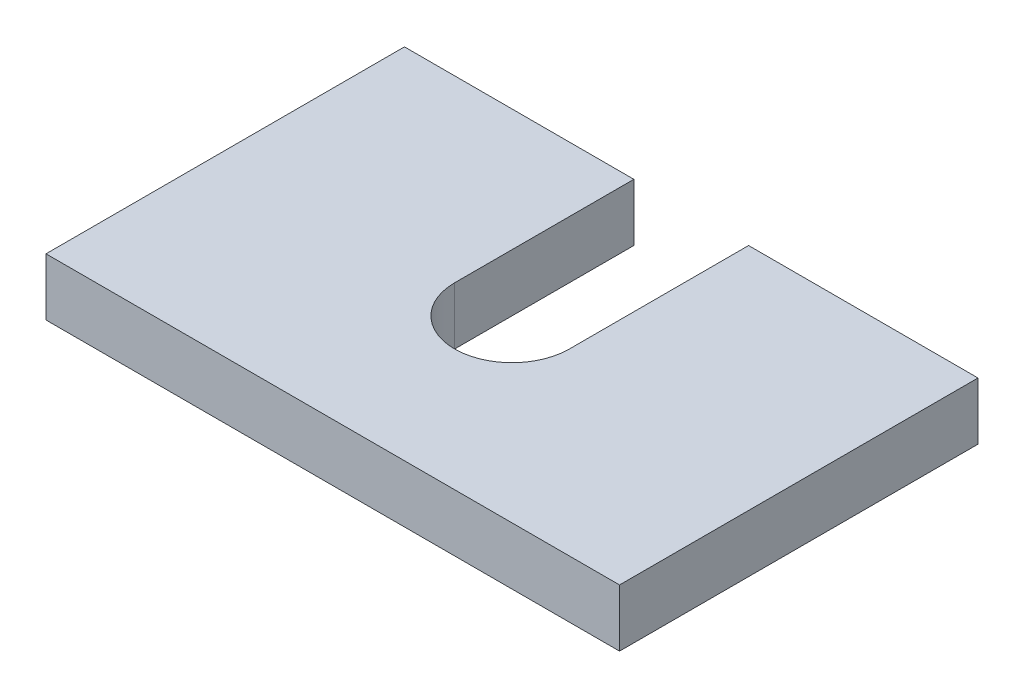
ISO-10303-21;
HEADER;
FILE_DESCRIPTION(('STEP AP214'),'2;1');
FILE_NAME('part.step','',(''),(''),'','','');
FILE_SCHEMA(('AUTOMOTIVE_DESIGN { 1 0 10303 214 1 1 1 1 }'));
ENDSEC;
DATA;
#1=APPLICATION_CONTEXT('core data for automotive mechanical design processes');
#2=APPLICATION_PROTOCOL_DEFINITION('international standard','automotive_design',2000,#1);
#3=PRODUCT_CONTEXT('',#1,'mechanical');
#4=PRODUCT('Part','Part','',(#3));
#5=PRODUCT_RELATED_PRODUCT_CATEGORY('part','',(#4));
#6=PRODUCT_DEFINITION_FORMATION('','',#4);
#7=PRODUCT_DEFINITION_CONTEXT('part definition',#1,'design');
#8=PRODUCT_DEFINITION('design','',#6,#7);
#9=PRODUCT_DEFINITION_SHAPE('','',#8);
#10=(LENGTH_UNIT() NAMED_UNIT(*) SI_UNIT(.MILLI.,.METRE.));
#11=(NAMED_UNIT(*) PLANE_ANGLE_UNIT() SI_UNIT($,.RADIAN.));
#12=(NAMED_UNIT(*) SI_UNIT($,.STERADIAN.) SOLID_ANGLE_UNIT());
#13=UNCERTAINTY_MEASURE_WITH_UNIT(LENGTH_MEASURE(1.E-05),#10,'distance_accuracy_value','');
#14=(GEOMETRIC_REPRESENTATION_CONTEXT(3) GLOBAL_UNCERTAINTY_ASSIGNED_CONTEXT((#13)) GLOBAL_UNIT_ASSIGNED_CONTEXT((#10,
#11,#12)) REPRESENTATION_CONTEXT('',''));
#15=CARTESIAN_POINT('',(0.,0.,0.));
#16=DIRECTION('',(0.,0.,1.));
#17=DIRECTION('',(1.,0.,0.));
#18=AXIS2_PLACEMENT_3D('',#15,#16,#17);
#19=CARTESIAN_POINT('',(4.,4.,-12.5));
#20=DIRECTION('',(0.,0.,1.));
#21=DIRECTION('',(1.,0.,0.));
#22=AXIS2_PLACEMENT_3D('',#19,#20,#21);
#23=PLANE('',#22);
#24=DIRECTION('',(-1.,0.,0.));
#25=VECTOR('',#24,1.);
#26=CARTESIAN_POINT('',(4.,0.,-12.5));
#27=LINE('',#26,#25);
#28=CARTESIAN_POINT('',(20.,0.,-12.5));
#29=VERTEX_POINT('',#28);
#30=CARTESIAN_POINT('',(4.,0.,-12.5));
#31=VERTEX_POINT('',#30);
#32=EDGE_CURVE('E128',#29,#31,#27,.T.);
#33=ORIENTED_EDGE('',*,*,#32,.T.);
#34=DIRECTION('',(0.,-1.,0.));
#35=VECTOR('',#34,1.);
#36=CARTESIAN_POINT('',(4.,4.,-12.5));
#37=LINE('',#36,#35);
#38=CARTESIAN_POINT('',(4.,4.,-12.5));
#39=VERTEX_POINT('',#38);
#40=EDGE_CURVE('E11',#39,#31,#37,.T.);
#41=ORIENTED_EDGE('',*,*,#40,.F.);
#42=DIRECTION('',(-1.,0.,0.));
#43=VECTOR('',#42,1.);
#44=CARTESIAN_POINT('',(4.,4.,-12.5));
#45=LINE('',#44,#43);
#46=CARTESIAN_POINT('',(20.,4.,-12.5));
#47=VERTEX_POINT('',#46);
#48=EDGE_CURVE('E142',#47,#39,#45,.T.);
#49=ORIENTED_EDGE('',*,*,#48,.F.);
#50=DIRECTION('',(0.,-1.,0.));
#51=VECTOR('',#50,1.);
#52=CARTESIAN_POINT('',(20.,4.,-12.5));
#53=LINE('',#52,#51);
#54=EDGE_CURVE('E124',#47,#29,#53,.T.);
#55=ORIENTED_EDGE('',*,*,#54,.T.);
#56=EDGE_LOOP('',(#33,#41,#49,#55));
#57=FACE_BOUND('',#56,.T.);
#58=ADVANCED_FACE('F32',(#57),#23,.F.);
#59=CARTESIAN_POINT('',(4.,4.,0.));
#60=DIRECTION('',(1.,0.,0.));
#61=DIRECTION('',(0.,0.,-1.));
#62=AXIS2_PLACEMENT_3D('',#59,#60,#61);
#63=PLANE('',#62);
#64=DIRECTION('',(0.,0.,1.));
#65=VECTOR('',#64,1.);
#66=CARTESIAN_POINT('',(4.,0.,0.));
#67=LINE('',#66,#65);
#68=CARTESIAN_POINT('',(4.,0.,0.));
#69=VERTEX_POINT('',#68);
#70=EDGE_CURVE('E131',#31,#69,#67,.T.);
#71=ORIENTED_EDGE('',*,*,#70,.T.);
#72=DIRECTION('',(0.,-1.,0.));
#73=VECTOR('',#72,1.);
#74=CARTESIAN_POINT('',(4.,4.,0.));
#75=LINE('',#74,#73);
#76=CARTESIAN_POINT('',(4.,4.,0.));
#77=VERTEX_POINT('',#76);
#78=EDGE_CURVE('E40',#77,#69,#75,.T.);
#79=ORIENTED_EDGE('',*,*,#78,.F.);
#80=DIRECTION('',(0.,0.,1.));
#81=VECTOR('',#80,1.);
#82=CARTESIAN_POINT('',(4.,4.,0.));
#83=LINE('',#82,#81);
#84=EDGE_CURVE('E91',#39,#77,#83,.T.);
#85=ORIENTED_EDGE('',*,*,#84,.F.);
#86=ORIENTED_EDGE('',*,*,#40,.T.);
#87=EDGE_LOOP('',(#71,#79,#85,#86));
#88=FACE_BOUND('',#87,.T.);
#89=ADVANCED_FACE('F177',(#88),#63,.F.);
#90=CARTESIAN_POINT('',(0.,4.,0.));
#91=DIRECTION('',(0.,-1.,0.));
#92=DIRECTION('',(0.,0.,-1.));
#93=AXIS2_PLACEMENT_3D('',#90,#91,#92);
#94=CYLINDRICAL_SURFACE('',#93,4.);
#95=CARTESIAN_POINT('',(0.,0.,0.));
#96=DIRECTION('',(0.,-1.,0.));
#97=DIRECTION('',(0.,0.,1.));
#98=AXIS2_PLACEMENT_3D('',#95,#96,#97);
#99=CIRCLE('',#98,4.);
#100=CARTESIAN_POINT('',(-4.,0.,0.));
#101=VERTEX_POINT('',#100);
#102=EDGE_CURVE('E133',#69,#101,#99,.T.);
#103=ORIENTED_EDGE('',*,*,#102,.T.);
#104=DIRECTION('',(0.,-1.,0.));
#105=VECTOR('',#104,1.);
#106=CARTESIAN_POINT('',(-4.,4.,0.));
#107=LINE('',#106,#105);
#108=CARTESIAN_POINT('',(-4.,4.,0.));
#109=VERTEX_POINT('',#108);
#110=EDGE_CURVE('E149',#109,#101,#107,.T.);
#111=ORIENTED_EDGE('',*,*,#110,.F.);
#112=CARTESIAN_POINT('',(0.,4.,0.));
#113=DIRECTION('',(0.,-1.,0.));
#114=DIRECTION('',(0.,0.,1.));
#115=AXIS2_PLACEMENT_3D('',#112,#113,#114);
#116=CIRCLE('',#115,4.);
#117=EDGE_CURVE('E157',#77,#109,#116,.T.);
#118=ORIENTED_EDGE('',*,*,#117,.F.);
#119=ORIENTED_EDGE('',*,*,#78,.T.);
#120=EDGE_LOOP('',(#103,#111,#118,#119));
#121=FACE_BOUND('',#120,.T.);
#122=ADVANCED_FACE('F155',(#121),#94,.F.);
#123=CARTESIAN_POINT('',(-4.,4.,0.));
#124=DIRECTION('',(-1.,0.,0.));
#125=DIRECTION('',(0.,0.,1.));
#126=AXIS2_PLACEMENT_3D('',#123,#124,#125);
#127=PLANE('',#126);
#128=DIRECTION('',(0.,0.,-1.));
#129=VECTOR('',#128,1.);
#130=CARTESIAN_POINT('',(-4.,0.,0.));
#131=LINE('',#130,#129);
#132=CARTESIAN_POINT('',(-4.,0.,-12.5));
#133=VERTEX_POINT('',#132);
#134=EDGE_CURVE('E135',#101,#133,#131,.T.);
#135=ORIENTED_EDGE('',*,*,#134,.T.);
#136=DIRECTION('',(0.,-1.,0.));
#137=VECTOR('',#136,1.);
#138=CARTESIAN_POINT('',(-4.,4.,-12.5));
#139=LINE('',#138,#137);
#140=CARTESIAN_POINT('',(-4.,4.,-12.5));
#141=VERTEX_POINT('',#140);
#142=EDGE_CURVE('E146',#141,#133,#139,.T.);
#143=ORIENTED_EDGE('',*,*,#142,.F.);
#144=DIRECTION('',(0.,0.,-1.));
#145=VECTOR('',#144,1.);
#146=CARTESIAN_POINT('',(-4.,4.,0.));
#147=LINE('',#146,#145);
#148=EDGE_CURVE('E169',#109,#141,#147,.T.);
#149=ORIENTED_EDGE('',*,*,#148,.F.);
#150=ORIENTED_EDGE('',*,*,#110,.T.);
#151=EDGE_LOOP('',(#135,#143,#149,#150));
#152=FACE_BOUND('',#151,.T.);
#153=ADVANCED_FACE('F165',(#152),#127,.F.);
#154=CARTESIAN_POINT('',(-20.,4.,-12.5));
#155=DIRECTION('',(0.,0.,1.));
#156=DIRECTION('',(1.,0.,0.));
#157=AXIS2_PLACEMENT_3D('',#154,#155,#156);
#158=PLANE('',#157);
#159=DIRECTION('',(-1.,0.,0.));
#160=VECTOR('',#159,1.);
#161=CARTESIAN_POINT('',(-20.,0.,-12.5));
#162=LINE('',#161,#160);
#163=CARTESIAN_POINT('',(-20.,0.,-12.5));
#164=VERTEX_POINT('',#163);
#165=EDGE_CURVE('E137',#133,#164,#162,.T.);
#166=ORIENTED_EDGE('',*,*,#165,.T.);
#167=DIRECTION('',(0.,-1.,0.));
#168=VECTOR('',#167,1.);
#169=CARTESIAN_POINT('',(-20.,4.,-12.5));
#170=LINE('',#169,#168);
#171=CARTESIAN_POINT('',(-20.,4.,-12.5));
#172=VERTEX_POINT('',#171);
#173=EDGE_CURVE('E119',#172,#164,#170,.T.);
#174=ORIENTED_EDGE('',*,*,#173,.F.);
#175=DIRECTION('',(-1.,0.,0.));
#176=VECTOR('',#175,1.);
#177=CARTESIAN_POINT('',(-20.,4.,-12.5));
#178=LINE('',#177,#176);
#179=EDGE_CURVE('E110',#141,#172,#178,.T.);
#180=ORIENTED_EDGE('',*,*,#179,.F.);
#181=ORIENTED_EDGE('',*,*,#142,.T.);
#182=EDGE_LOOP('',(#166,#174,#180,#181));
#183=FACE_BOUND('',#182,.T.);
#184=ADVANCED_FACE('F168',(#183),#158,.F.);
#185=CARTESIAN_POINT('',(-20.,4.,12.5));
#186=DIRECTION('',(1.,0.,0.));
#187=DIRECTION('',(0.,0.,-1.));
#188=AXIS2_PLACEMENT_3D('',#185,#186,#187);
#189=PLANE('',#188);
#190=DIRECTION('',(0.,0.,1.));
#191=VECTOR('',#190,1.);
#192=CARTESIAN_POINT('',(-20.,0.,12.5));
#193=LINE('',#192,#191);
#194=CARTESIAN_POINT('',(-20.,0.,12.5));
#195=VERTEX_POINT('',#194);
#196=EDGE_CURVE('E118',#164,#195,#193,.T.);
#197=ORIENTED_EDGE('',*,*,#196,.T.);
#198=DIRECTION('',(0.,-1.,0.));
#199=VECTOR('',#198,1.);
#200=CARTESIAN_POINT('',(-20.,4.,12.5));
#201=LINE('',#200,#199);
#202=CARTESIAN_POINT('',(-20.,4.,12.5));
#203=VERTEX_POINT('',#202);
#204=EDGE_CURVE('E115',#203,#195,#201,.T.);
#205=ORIENTED_EDGE('',*,*,#204,.F.);
#206=DIRECTION('',(0.,0.,1.));
#207=VECTOR('',#206,1.);
#208=CARTESIAN_POINT('',(-20.,4.,12.5));
#209=LINE('',#208,#207);
#210=EDGE_CURVE('E104',#172,#203,#209,.T.);
#211=ORIENTED_EDGE('',*,*,#210,.F.);
#212=ORIENTED_EDGE('',*,*,#173,.T.);
#213=EDGE_LOOP('',(#197,#205,#211,#212));
#214=FACE_BOUND('',#213,.T.);
#215=ADVANCED_FACE('F116',(#214),#189,.F.);
#216=CARTESIAN_POINT('',(-20.,4.,12.5));
#217=DIRECTION('',(0.,0.,-1.));
#218=DIRECTION('',(-1.,0.,0.));
#219=AXIS2_PLACEMENT_3D('',#216,#217,#218);
#220=PLANE('',#219);
#221=DIRECTION('',(1.,0.,0.));
#222=VECTOR('',#221,1.);
#223=CARTESIAN_POINT('',(-20.,0.,12.5));
#224=LINE('',#223,#222);
#225=CARTESIAN_POINT('',(20.,0.,12.5));
#226=VERTEX_POINT('',#225);
#227=EDGE_CURVE('E77',#195,#226,#224,.T.);
#228=ORIENTED_EDGE('',*,*,#227,.T.);
#229=DIRECTION('',(0.,-1.,0.));
#230=VECTOR('',#229,1.);
#231=CARTESIAN_POINT('',(20.,4.,12.5));
#232=LINE('',#231,#230);
#233=CARTESIAN_POINT('',(20.,4.,12.5));
#234=VERTEX_POINT('',#233);
#235=EDGE_CURVE('E120',#234,#226,#232,.T.);
#236=ORIENTED_EDGE('',*,*,#235,.F.);
#237=DIRECTION('',(1.,0.,0.));
#238=VECTOR('',#237,1.);
#239=CARTESIAN_POINT('',(-20.,4.,12.5));
#240=LINE('',#239,#238);
#241=EDGE_CURVE('E108',#203,#234,#240,.T.);
#242=ORIENTED_EDGE('',*,*,#241,.F.);
#243=ORIENTED_EDGE('',*,*,#204,.T.);
#244=EDGE_LOOP('',(#228,#236,#242,#243));
#245=FACE_BOUND('',#244,.T.);
#246=ADVANCED_FACE('F122',(#245),#220,.F.);
#247=CARTESIAN_POINT('',(20.,4.,12.5));
#248=DIRECTION('',(-1.,0.,0.));
#249=DIRECTION('',(0.,0.,1.));
#250=AXIS2_PLACEMENT_3D('',#247,#248,#249);
#251=PLANE('',#250);
#252=DIRECTION('',(0.,0.,-1.));
#253=VECTOR('',#252,1.);
#254=CARTESIAN_POINT('',(20.,0.,12.5));
#255=LINE('',#254,#253);
#256=EDGE_CURVE('E83',#226,#29,#255,.T.);
#257=ORIENTED_EDGE('',*,*,#256,.T.);
#258=ORIENTED_EDGE('',*,*,#54,.F.);
#259=DIRECTION('',(0.,0.,-1.));
#260=VECTOR('',#259,1.);
#261=CARTESIAN_POINT('',(20.,4.,12.5));
#262=LINE('',#261,#260);
#263=EDGE_CURVE('E48',#234,#47,#262,.T.);
#264=ORIENTED_EDGE('',*,*,#263,.F.);
#265=ORIENTED_EDGE('',*,*,#235,.T.);
#266=EDGE_LOOP('',(#257,#258,#264,#265));
#267=FACE_BOUND('',#266,.T.);
#268=ADVANCED_FACE('F193',(#267),#251,.F.);
#269=CARTESIAN_POINT('',(0.,4.,0.));
#270=DIRECTION('',(0.,1.,0.));
#271=DIRECTION('',(0.,0.,1.));
#272=AXIS2_PLACEMENT_3D('',#269,#270,#271);
#273=PLANE('',#272);
#274=ORIENTED_EDGE('',*,*,#48,.T.);
#275=ORIENTED_EDGE('',*,*,#84,.T.);
#276=ORIENTED_EDGE('',*,*,#117,.T.);
#277=ORIENTED_EDGE('',*,*,#148,.T.);
#278=ORIENTED_EDGE('',*,*,#179,.T.);
#279=ORIENTED_EDGE('',*,*,#210,.T.);
#280=ORIENTED_EDGE('',*,*,#241,.T.);
#281=ORIENTED_EDGE('',*,*,#263,.T.);
#282=EDGE_LOOP('',(#274,#275,#276,#277,#278,#279,#280,#281));
#283=FACE_BOUND('',#282,.T.);
#284=ADVANCED_FACE('F106',(#283),#273,.T.);
#285=CARTESIAN_POINT('',(0.,0.,0.));
#286=DIRECTION('',(0.,1.,0.));
#287=DIRECTION('',(0.,0.,1.));
#288=AXIS2_PLACEMENT_3D('',#285,#286,#287);
#289=PLANE('',#288);
#290=ORIENTED_EDGE('',*,*,#32,.F.);
#291=ORIENTED_EDGE('',*,*,#256,.F.);
#292=ORIENTED_EDGE('',*,*,#227,.F.);
#293=ORIENTED_EDGE('',*,*,#196,.F.);
#294=ORIENTED_EDGE('',*,*,#165,.F.);
#295=ORIENTED_EDGE('',*,*,#134,.F.);
#296=ORIENTED_EDGE('',*,*,#102,.F.);
#297=ORIENTED_EDGE('',*,*,#70,.F.);
#298=EDGE_LOOP('',(#290,#291,#292,#293,#294,#295,#296,#297));
#299=FACE_BOUND('',#298,.T.);
#300=ADVANCED_FACE('F161',(#299),#289,.F.);
#301=CLOSED_SHELL('',(#58,#89,#122,#153,#184,#215,#246,#268,#284,#300));
#302=MANIFOLD_SOLID_BREP('B2',#301);
#303=ADVANCED_BREP_SHAPE_REPRESENTATION('',(#18,#302),#14);
#304=SHAPE_DEFINITION_REPRESENTATION(#9,#303);
ENDSEC;
END-ISO-10303-21;
